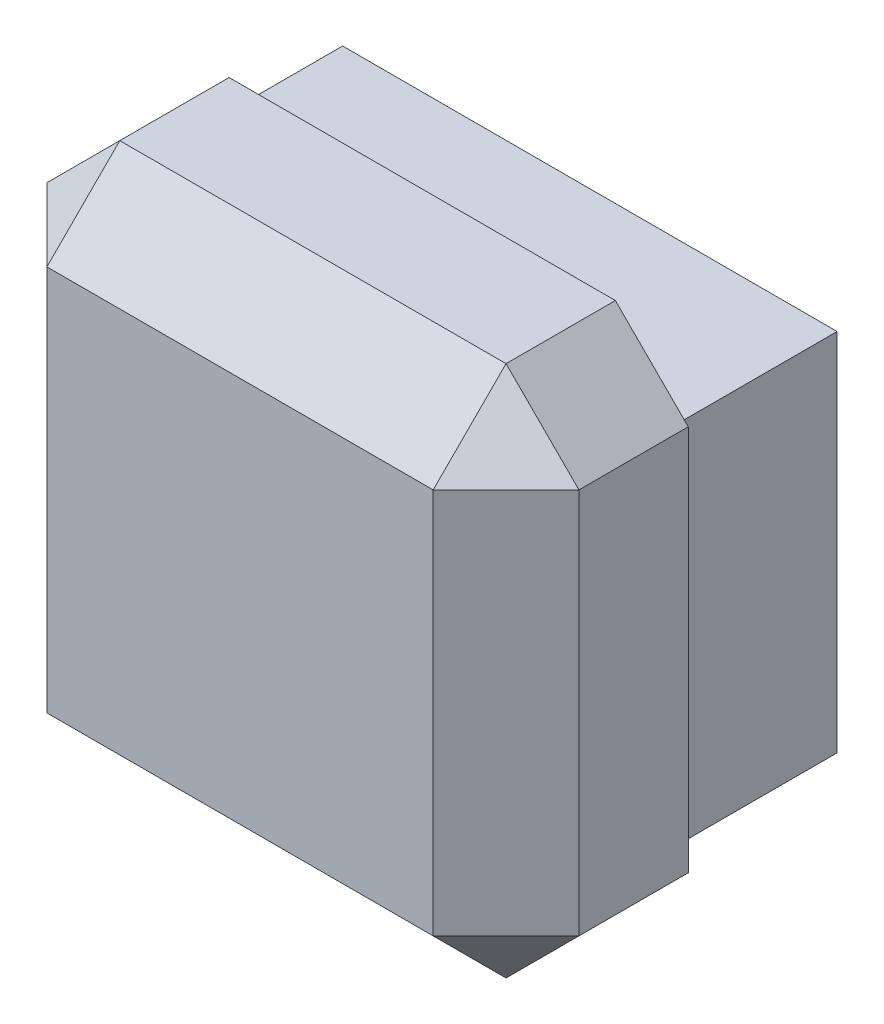
ISO-10303-21;
HEADER;
FILE_DESCRIPTION(('STEP AP214'),'2;1');
FILE_NAME('part.step','',(''),(''),'','','');
FILE_SCHEMA(('AUTOMOTIVE_DESIGN { 1 0 10303 214 1 1 1 1 }'));
ENDSEC;
DATA;
#1=APPLICATION_CONTEXT('core data for automotive mechanical design processes');
#2=APPLICATION_PROTOCOL_DEFINITION('international standard','automotive_design',2000,#1);
#3=PRODUCT_CONTEXT('',#1,'mechanical');
#4=PRODUCT('Part','Part','',(#3));
#5=PRODUCT_RELATED_PRODUCT_CATEGORY('part','',(#4));
#6=PRODUCT_DEFINITION_FORMATION('','',#4);
#7=PRODUCT_DEFINITION_CONTEXT('part definition',#1,'design');
#8=PRODUCT_DEFINITION('design','',#6,#7);
#9=PRODUCT_DEFINITION_SHAPE('','',#8);
#10=(LENGTH_UNIT() NAMED_UNIT(*) SI_UNIT(.MILLI.,.METRE.));
#11=(NAMED_UNIT(*) PLANE_ANGLE_UNIT() SI_UNIT($,.RADIAN.));
#12=(NAMED_UNIT(*) SI_UNIT($,.STERADIAN.) SOLID_ANGLE_UNIT());
#13=UNCERTAINTY_MEASURE_WITH_UNIT(LENGTH_MEASURE(1.E-05),#10,'distance_accuracy_value','');
#14=(GEOMETRIC_REPRESENTATION_CONTEXT(3) GLOBAL_UNCERTAINTY_ASSIGNED_CONTEXT((#13)) GLOBAL_UNIT_ASSIGNED_CONTEXT((#10,
#11,#12)) REPRESENTATION_CONTEXT('',''));
#15=CARTESIAN_POINT('',(0.,0.,0.));
#16=DIRECTION('',(0.,0.,1.));
#17=DIRECTION('',(1.,0.,0.));
#18=AXIS2_PLACEMENT_3D('',#15,#16,#17);
#19=CARTESIAN_POINT('',(3.3923,-2.5033,-2.3));
#20=DIRECTION('',(1.,0.,0.));
#21=DIRECTION('',(0.,0.,-1.));
#22=AXIS2_PLACEMENT_3D('',#19,#20,#21);
#23=PLANE('',#22);
#24=DIRECTION('',(0.,1.,0.));
#25=VECTOR('',#24,1.);
#26=CARTESIAN_POINT('',(3.3923,-2.5033,0.));
#27=LINE('',#26,#25);
#28=CARTESIAN_POINT('',(3.3923,-2.5033,0.));
#29=VERTEX_POINT('',#28);
#30=CARTESIAN_POINT('',(3.3923,2.5033,0.));
#31=VERTEX_POINT('',#30);
#32=EDGE_CURVE('E209',#29,#31,#27,.T.);
#33=ORIENTED_EDGE('',*,*,#32,.F.);
#34=DIRECTION('',(0.,0.,1.));
#35=VECTOR('',#34,1.);
#36=CARTESIAN_POINT('',(3.3923,-2.5033,-2.3));
#37=LINE('',#36,#35);
#38=CARTESIAN_POINT('',(3.3923,-2.5033,-2.3));
#39=VERTEX_POINT('',#38);
#40=EDGE_CURVE('E236',#39,#29,#37,.T.);
#41=ORIENTED_EDGE('',*,*,#40,.F.);
#42=DIRECTION('',(0.,1.,0.));
#43=VECTOR('',#42,1.);
#44=CARTESIAN_POINT('',(3.3923,-2.5033,-2.3));
#45=LINE('',#44,#43);
#46=CARTESIAN_POINT('',(3.3923,2.5033,-2.3));
#47=VERTEX_POINT('',#46);
#48=EDGE_CURVE('E212',#39,#47,#45,.T.);
#49=ORIENTED_EDGE('',*,*,#48,.T.);
#50=DIRECTION('',(0.,0.,1.));
#51=VECTOR('',#50,1.);
#52=CARTESIAN_POINT('',(3.3923,2.5033,-2.3));
#53=LINE('',#52,#51);
#54=EDGE_CURVE('E225',#47,#31,#53,.T.);
#55=ORIENTED_EDGE('',*,*,#54,.T.);
#56=EDGE_LOOP('',(#33,#41,#49,#55));
#57=FACE_BOUND('',#56,.T.);
#58=ADVANCED_FACE('F33',(#57),#23,.T.);
#59=CARTESIAN_POINT('',(-3.3923,-2.5033,-2.3));
#60=DIRECTION('',(0.,-1.,0.));
#61=DIRECTION('',(0.,0.,-1.));
#62=AXIS2_PLACEMENT_3D('',#59,#60,#61);
#63=PLANE('',#62);
#64=DIRECTION('',(1.,0.,0.));
#65=VECTOR('',#64,1.);
#66=CARTESIAN_POINT('',(-3.3923,-2.5033,0.));
#67=LINE('',#66,#65);
#68=CARTESIAN_POINT('',(-3.3923,-2.5033,0.));
#69=VERTEX_POINT('',#68);
#70=EDGE_CURVE('E216',#69,#29,#67,.T.);
#71=ORIENTED_EDGE('',*,*,#70,.F.);
#72=DIRECTION('',(0.,0.,1.));
#73=VECTOR('',#72,1.);
#74=CARTESIAN_POINT('',(-3.3923,-2.5033,-2.3));
#75=LINE('',#74,#73);
#76=CARTESIAN_POINT('',(-3.3923,-2.5033,-2.3));
#77=VERTEX_POINT('',#76);
#78=EDGE_CURVE('E240',#77,#69,#75,.T.);
#79=ORIENTED_EDGE('',*,*,#78,.F.);
#80=DIRECTION('',(1.,0.,0.));
#81=VECTOR('',#80,1.);
#82=CARTESIAN_POINT('',(-3.3923,-2.5033,-2.3));
#83=LINE('',#82,#81);
#84=EDGE_CURVE('E222',#77,#39,#83,.T.);
#85=ORIENTED_EDGE('',*,*,#84,.T.);
#86=ORIENTED_EDGE('',*,*,#40,.T.);
#87=EDGE_LOOP('',(#71,#79,#85,#86));
#88=FACE_BOUND('',#87,.T.);
#89=ADVANCED_FACE('F383',(#88),#63,.T.);
#90=CARTESIAN_POINT('',(-3.3923,-2.5033,-2.3));
#91=DIRECTION('',(-1.,0.,0.));
#92=DIRECTION('',(0.,0.,1.));
#93=AXIS2_PLACEMENT_3D('',#90,#91,#92);
#94=PLANE('',#93);
#95=DIRECTION('',(0.,-1.,0.));
#96=VECTOR('',#95,1.);
#97=CARTESIAN_POINT('',(-3.3923,-2.5033,0.));
#98=LINE('',#97,#96);
#99=CARTESIAN_POINT('',(-3.3923,2.5033,0.));
#100=VERTEX_POINT('',#99);
#101=EDGE_CURVE('E231',#100,#69,#98,.T.);
#102=ORIENTED_EDGE('',*,*,#101,.F.);
#103=DIRECTION('',(0.,0.,1.));
#104=VECTOR('',#103,1.);
#105=CARTESIAN_POINT('',(-3.3923,2.5033,-2.3));
#106=LINE('',#105,#104);
#107=CARTESIAN_POINT('',(-3.3923,2.5033,-2.3));
#108=VERTEX_POINT('',#107);
#109=EDGE_CURVE('E242',#108,#100,#106,.T.);
#110=ORIENTED_EDGE('',*,*,#109,.F.);
#111=DIRECTION('',(0.,-1.,0.));
#112=VECTOR('',#111,1.);
#113=CARTESIAN_POINT('',(-3.3923,-2.5033,-2.3));
#114=LINE('',#113,#112);
#115=EDGE_CURVE('E219',#108,#77,#114,.T.);
#116=ORIENTED_EDGE('',*,*,#115,.T.);
#117=ORIENTED_EDGE('',*,*,#78,.T.);
#118=EDGE_LOOP('',(#102,#110,#116,#117));
#119=FACE_BOUND('',#118,.T.);
#120=ADVANCED_FACE('F389',(#119),#94,.T.);
#121=CARTESIAN_POINT('',(-3.3923,2.5033,-2.3));
#122=DIRECTION('',(0.,1.,0.));
#123=DIRECTION('',(0.,0.,1.));
#124=AXIS2_PLACEMENT_3D('',#121,#122,#123);
#125=PLANE('',#124);
#126=DIRECTION('',(-1.,0.,0.));
#127=VECTOR('',#126,1.);
#128=CARTESIAN_POINT('',(-3.3923,2.5033,0.));
#129=LINE('',#128,#127);
#130=EDGE_CURVE('E228',#31,#100,#129,.T.);
#131=ORIENTED_EDGE('',*,*,#130,.F.);
#132=ORIENTED_EDGE('',*,*,#54,.F.);
#133=DIRECTION('',(-1.,0.,0.));
#134=VECTOR('',#133,1.);
#135=CARTESIAN_POINT('',(-3.3923,2.5033,-2.3));
#136=LINE('',#135,#134);
#137=EDGE_CURVE('E215',#47,#108,#136,.T.);
#138=ORIENTED_EDGE('',*,*,#137,.T.);
#139=ORIENTED_EDGE('',*,*,#109,.T.);
#140=EDGE_LOOP('',(#131,#132,#138,#139));
#141=FACE_BOUND('',#140,.T.);
#142=ADVANCED_FACE('F394',(#141),#125,.T.);
#143=CARTESIAN_POINT('',(0.,0.,-2.3));
#144=DIRECTION('',(0.,0.,-1.));
#145=DIRECTION('',(-1.,0.,0.));
#146=AXIS2_PLACEMENT_3D('',#143,#144,#145);
#147=PLANE('',#146);
#148=DIRECTION('',(0.,1.,0.));
#149=VECTOR('',#148,1.);
#150=CARTESIAN_POINT('',(1.9423,-1.0533,-2.3));
#151=LINE('',#150,#149);
#152=CARTESIAN_POINT('',(1.9423,-1.0533,-2.3));
#153=VERTEX_POINT('',#152);
#154=CARTESIAN_POINT('',(1.9423,1.0533,-2.3));
#155=VERTEX_POINT('',#154);
#156=EDGE_CURVE('E198',#153,#155,#151,.T.);
#157=ORIENTED_EDGE('',*,*,#156,.T.);
#158=DIRECTION('',(-1.,0.,0.));
#159=VECTOR('',#158,1.);
#160=CARTESIAN_POINT('',(-1.9423,1.0533,-2.3));
#161=LINE('',#160,#159);
#162=CARTESIAN_POINT('',(-1.9423,1.0533,-2.3));
#163=VERTEX_POINT('',#162);
#164=EDGE_CURVE('E201',#155,#163,#161,.T.);
#165=ORIENTED_EDGE('',*,*,#164,.T.);
#166=DIRECTION('',(0.,-1.,0.));
#167=VECTOR('',#166,1.);
#168=CARTESIAN_POINT('',(-1.9423,-1.0533,-2.3));
#169=LINE('',#168,#167);
#170=CARTESIAN_POINT('',(-1.9423,-1.0533,-2.3));
#171=VERTEX_POINT('',#170);
#172=EDGE_CURVE('E164',#163,#171,#169,.T.);
#173=ORIENTED_EDGE('',*,*,#172,.T.);
#174=DIRECTION('',(1.,0.,0.));
#175=VECTOR('',#174,1.);
#176=CARTESIAN_POINT('',(-1.9423,-1.0533,-2.3));
#177=LINE('',#176,#175);
#178=EDGE_CURVE('E204',#171,#153,#177,.T.);
#179=ORIENTED_EDGE('',*,*,#178,.T.);
#180=EDGE_LOOP('',(#157,#165,#173,#179));
#181=FACE_BOUND('',#180,.T.);
#182=ORIENTED_EDGE('',*,*,#48,.F.);
#183=ORIENTED_EDGE('',*,*,#84,.F.);
#184=ORIENTED_EDGE('',*,*,#115,.F.);
#185=ORIENTED_EDGE('',*,*,#137,.F.);
#186=EDGE_LOOP('',(#182,#183,#184,#185));
#187=FACE_BOUND('',#186,.T.);
#188=ADVANCED_FACE('F429',(#181,#187),#147,.T.);
#189=CARTESIAN_POINT('',(1.9423,-1.0533,-2.3));
#190=DIRECTION('',(1.,0.,0.));
#191=DIRECTION('',(0.,0.,-1.));
#192=AXIS2_PLACEMENT_3D('',#189,#190,#191);
#193=PLANE('',#192);
#194=DIRECTION('',(0.,0.,1.));
#195=VECTOR('',#194,1.);
#196=CARTESIAN_POINT('',(1.9423,-1.0533,-2.3));
#197=LINE('',#196,#195);
#198=CARTESIAN_POINT('',(1.9423,-1.0533,1.1));
#199=VERTEX_POINT('',#198);
#200=EDGE_CURVE('E207',#153,#199,#197,.T.);
#201=ORIENTED_EDGE('',*,*,#200,.T.);
#202=DIRECTION('',(0.,-1.,0.));
#203=VECTOR('',#202,1.);
#204=CARTESIAN_POINT('',(1.9423,1.0533,1.1));
#205=LINE('',#204,#203);
#206=CARTESIAN_POINT('',(1.9423,1.0533,1.1));
#207=VERTEX_POINT('',#206);
#208=EDGE_CURVE('E177',#207,#199,#205,.T.);
#209=ORIENTED_EDGE('',*,*,#208,.F.);
#210=DIRECTION('',(0.,0.,1.));
#211=VECTOR('',#210,1.);
#212=CARTESIAN_POINT('',(1.9423,1.0533,-2.3));
#213=LINE('',#212,#211);
#214=EDGE_CURVE('E169',#155,#207,#213,.T.);
#215=ORIENTED_EDGE('',*,*,#214,.F.);
#216=ORIENTED_EDGE('',*,*,#156,.F.);
#217=EDGE_LOOP('',(#201,#209,#215,#216));
#218=FACE_BOUND('',#217,.T.);
#219=ADVANCED_FACE('F421',(#218),#193,.F.);
#220=CARTESIAN_POINT('',(-1.9423,-1.0533,-2.3));
#221=DIRECTION('',(0.,-1.,0.));
#222=DIRECTION('',(0.,0.,-1.));
#223=AXIS2_PLACEMENT_3D('',#220,#221,#222);
#224=PLANE('',#223);
#225=DIRECTION('',(0.,0.,1.));
#226=VECTOR('',#225,1.);
#227=CARTESIAN_POINT('',(-1.9423,-1.0533,-2.3));
#228=LINE('',#227,#226);
#229=CARTESIAN_POINT('',(-1.9423,-1.0533,1.1));
#230=VERTEX_POINT('',#229);
#231=EDGE_CURVE('E168',#171,#230,#228,.T.);
#232=ORIENTED_EDGE('',*,*,#231,.T.);
#233=DIRECTION('',(-1.,0.,0.));
#234=VECTOR('',#233,1.);
#235=CARTESIAN_POINT('',(1.9423,-1.0533,1.1));
#236=LINE('',#235,#234);
#237=EDGE_CURVE('E181',#199,#230,#236,.T.);
#238=ORIENTED_EDGE('',*,*,#237,.F.);
#239=ORIENTED_EDGE('',*,*,#200,.F.);
#240=ORIENTED_EDGE('',*,*,#178,.F.);
#241=EDGE_LOOP('',(#232,#238,#239,#240));
#242=FACE_BOUND('',#241,.T.);
#243=ADVANCED_FACE('F418',(#242),#224,.F.);
#244=CARTESIAN_POINT('',(-1.9423,-1.0533,-2.3));
#245=DIRECTION('',(-1.,0.,0.));
#246=DIRECTION('',(0.,0.,1.));
#247=AXIS2_PLACEMENT_3D('',#244,#245,#246);
#248=PLANE('',#247);
#249=DIRECTION('',(0.,0.,1.));
#250=VECTOR('',#249,1.);
#251=CARTESIAN_POINT('',(-1.9423,1.0533,-2.3));
#252=LINE('',#251,#250);
#253=CARTESIAN_POINT('',(-1.9423,1.0533,1.1));
#254=VERTEX_POINT('',#253);
#255=EDGE_CURVE('E157',#163,#254,#252,.T.);
#256=ORIENTED_EDGE('',*,*,#255,.T.);
#257=DIRECTION('',(0.,1.,0.));
#258=VECTOR('',#257,1.);
#259=CARTESIAN_POINT('',(-1.9423,-1.0533,1.1));
#260=LINE('',#259,#258);
#261=EDGE_CURVE('E161',#230,#254,#260,.T.);
#262=ORIENTED_EDGE('',*,*,#261,.F.);
#263=ORIENTED_EDGE('',*,*,#231,.F.);
#264=ORIENTED_EDGE('',*,*,#172,.F.);
#265=EDGE_LOOP('',(#256,#262,#263,#264));
#266=FACE_BOUND('',#265,.T.);
#267=ADVANCED_FACE('F159',(#266),#248,.F.);
#268=CARTESIAN_POINT('',(-1.9423,1.0533,-2.3));
#269=DIRECTION('',(0.,1.,0.));
#270=DIRECTION('',(0.,0.,1.));
#271=AXIS2_PLACEMENT_3D('',#268,#269,#270);
#272=PLANE('',#271);
#273=ORIENTED_EDGE('',*,*,#214,.T.);
#274=DIRECTION('',(1.,0.,0.));
#275=VECTOR('',#274,1.);
#276=CARTESIAN_POINT('',(-1.9423,1.0533,1.1));
#277=LINE('',#276,#275);
#278=EDGE_CURVE('E172',#254,#207,#277,.T.);
#279=ORIENTED_EDGE('',*,*,#278,.F.);
#280=ORIENTED_EDGE('',*,*,#255,.F.);
#281=ORIENTED_EDGE('',*,*,#164,.F.);
#282=EDGE_LOOP('',(#273,#279,#280,#281));
#283=FACE_BOUND('',#282,.T.);
#284=ADVANCED_FACE('F173',(#283),#272,.F.);
#285=CARTESIAN_POINT('',(0.,0.,0.));
#286=DIRECTION('',(0.,0.,-1.));
#287=DIRECTION('',(-1.,0.,0.));
#288=AXIS2_PLACEMENT_3D('',#285,#286,#287);
#289=PLANE('',#288);
#290=ORIENTED_EDGE('',*,*,#70,.T.);
#291=ORIENTED_EDGE('',*,*,#32,.T.);
#292=ORIENTED_EDGE('',*,*,#130,.T.);
#293=ORIENTED_EDGE('',*,*,#101,.T.);
#294=EDGE_LOOP('',(#290,#291,#292,#293));
#295=FACE_BOUND('',#294,.T.);
#296=DIRECTION('',(0.,1.,0.));
#297=VECTOR('',#296,1.);
#298=CARTESIAN_POINT('',(3.65,-3.65,0.));
#299=LINE('',#298,#297);
#300=CARTESIAN_POINT('',(3.65,-2.65,0.));
#301=VERTEX_POINT('',#300);
#302=CARTESIAN_POINT('',(3.65,2.65,0.));
#303=VERTEX_POINT('',#302);
#304=EDGE_CURVE('E187',#301,#303,#299,.T.);
#305=ORIENTED_EDGE('',*,*,#304,.F.);
#306=DIRECTION('',(0.707106781186546,0.707106781186549,0.));
#307=VECTOR('',#306,1.);
#308=CARTESIAN_POINT('',(3.15,-3.14999999999999,0.));
#309=LINE('',#308,#307);
#310=CARTESIAN_POINT('',(2.65,-3.65,0.));
#311=VERTEX_POINT('',#310);
#312=EDGE_CURVE('E272',#301,#311,#309,.F.);
#313=ORIENTED_EDGE('',*,*,#312,.T.);
#314=DIRECTION('',(1.,0.,0.));
#315=VECTOR('',#314,1.);
#316=CARTESIAN_POINT('',(-3.65,-3.65,0.));
#317=LINE('',#316,#315);
#318=CARTESIAN_POINT('',(-2.65,-3.65,0.));
#319=VERTEX_POINT('',#318);
#320=EDGE_CURVE('E195',#319,#311,#317,.T.);
#321=ORIENTED_EDGE('',*,*,#320,.F.);
#322=DIRECTION('',(0.707106781186546,-0.707106781186549,0.));
#323=VECTOR('',#322,1.);
#324=CARTESIAN_POINT('',(-3.15000000000001,-3.14999999999999,0.));
#325=LINE('',#324,#323);
#326=CARTESIAN_POINT('',(-3.65,-2.65,0.));
#327=VERTEX_POINT('',#326);
#328=EDGE_CURVE('E266',#319,#327,#325,.F.);
#329=ORIENTED_EDGE('',*,*,#328,.T.);
#330=DIRECTION('',(0.,-1.,0.));
#331=VECTOR('',#330,1.);
#332=CARTESIAN_POINT('',(-3.65,-3.65,0.));
#333=LINE('',#332,#331);
#334=CARTESIAN_POINT('',(-3.65,2.65,0.));
#335=VERTEX_POINT('',#334);
#336=EDGE_CURVE('E193',#335,#327,#333,.T.);
#337=ORIENTED_EDGE('',*,*,#336,.F.);
#338=DIRECTION('',(-0.707106781186546,-0.707106781186549,0.));
#339=VECTOR('',#338,1.);
#340=CARTESIAN_POINT('',(-3.15,3.14999999999999,0.));
#341=LINE('',#340,#339);
#342=CARTESIAN_POINT('',(-2.65,3.65,0.));
#343=VERTEX_POINT('',#342);
#344=EDGE_CURVE('E268',#335,#343,#341,.F.);
#345=ORIENTED_EDGE('',*,*,#344,.T.);
#346=DIRECTION('',(-1.,0.,0.));
#347=VECTOR('',#346,1.);
#348=CARTESIAN_POINT('',(-3.65,3.65,0.));
#349=LINE('',#348,#347);
#350=CARTESIAN_POINT('',(2.65,3.65,0.));
#351=VERTEX_POINT('',#350);
#352=EDGE_CURVE('E190',#351,#343,#349,.T.);
#353=ORIENTED_EDGE('',*,*,#352,.F.);
#354=DIRECTION('',(-0.707106781186546,0.707106781186549,0.));
#355=VECTOR('',#354,1.);
#356=CARTESIAN_POINT('',(3.15,3.14999999999999,0.));
#357=LINE('',#356,#355);
#358=EDGE_CURVE('E270',#351,#303,#357,.F.);
#359=ORIENTED_EDGE('',*,*,#358,.T.);
#360=EDGE_LOOP('',(#305,#313,#321,#329,#337,#345,#353,#359));
#361=FACE_BOUND('',#360,.T.);
#362=ADVANCED_FACE('F345',(#295,#361),#289,.T.);
#363=CARTESIAN_POINT('',(0.,0.,2.5));
#364=DIRECTION('',(0.,0.,-1.));
#365=DIRECTION('',(-1.,0.,0.));
#366=AXIS2_PLACEMENT_3D('',#363,#364,#365);
#367=PLANE('',#366);
#368=DIRECTION('',(0.,-1.,0.));
#369=VECTOR('',#368,1.);
#370=CARTESIAN_POINT('',(-2.65,0.,2.5));
#371=LINE('',#370,#369);
#372=CARTESIAN_POINT('',(-2.65,2.65,2.5));
#373=VERTEX_POINT('',#372);
#374=CARTESIAN_POINT('',(-2.65,-2.65,2.5));
#375=VERTEX_POINT('',#374);
#376=EDGE_CURVE('E239',#373,#375,#371,.T.);
#377=ORIENTED_EDGE('',*,*,#376,.T.);
#378=DIRECTION('',(1.,0.,0.));
#379=VECTOR('',#378,1.);
#380=CARTESIAN_POINT('',(0.,-2.65,2.5));
#381=LINE('',#380,#379);
#382=CARTESIAN_POINT('',(2.65,-2.65,2.5));
#383=VERTEX_POINT('',#382);
#384=EDGE_CURVE('E250',#375,#383,#381,.T.);
#385=ORIENTED_EDGE('',*,*,#384,.T.);
#386=DIRECTION('',(0.,1.,0.));
#387=VECTOR('',#386,1.);
#388=CARTESIAN_POINT('',(2.65,0.,2.5));
#389=LINE('',#388,#387);
#390=CARTESIAN_POINT('',(2.65,2.65,2.5));
#391=VERTEX_POINT('',#390);
#392=EDGE_CURVE('E248',#383,#391,#389,.T.);
#393=ORIENTED_EDGE('',*,*,#392,.T.);
#394=DIRECTION('',(-1.,0.,0.));
#395=VECTOR('',#394,1.);
#396=CARTESIAN_POINT('',(0.,2.65,2.5));
#397=LINE('',#396,#395);
#398=EDGE_CURVE('E246',#391,#373,#397,.T.);
#399=ORIENTED_EDGE('',*,*,#398,.T.);
#400=EDGE_LOOP('',(#377,#385,#393,#399));
#401=FACE_BOUND('',#400,.T.);
#402=ADVANCED_FACE('F325',(#401),#367,.F.);
#403=CARTESIAN_POINT('',(-3.65,-3.65,2.5));
#404=DIRECTION('',(0.,1.,0.));
#405=DIRECTION('',(0.,0.,1.));
#406=AXIS2_PLACEMENT_3D('',#403,#404,#405);
#407=PLANE('',#406);
#408=ORIENTED_EDGE('',*,*,#320,.T.);
#409=DIRECTION('',(0.,0.,1.));
#410=VECTOR('',#409,1.);
#411=CARTESIAN_POINT('',(2.65,-3.65,2.5));
#412=LINE('',#411,#410);
#413=CARTESIAN_POINT('',(2.65,-3.65,1.5));
#414=VERTEX_POINT('',#413);
#415=EDGE_CURVE('E258',#311,#414,#412,.T.);
#416=ORIENTED_EDGE('',*,*,#415,.T.);
#417=DIRECTION('',(-1.,0.,0.));
#418=VECTOR('',#417,1.);
#419=CARTESIAN_POINT('',(-3.65,-3.65,1.5));
#420=LINE('',#419,#418);
#421=CARTESIAN_POINT('',(-2.65,-3.65,1.5));
#422=VERTEX_POINT('',#421);
#423=EDGE_CURVE('E255',#414,#422,#420,.T.);
#424=ORIENTED_EDGE('',*,*,#423,.T.);
#425=DIRECTION('',(0.,0.,-1.));
#426=VECTOR('',#425,1.);
#427=CARTESIAN_POINT('',(-2.65,-3.65,2.5));
#428=LINE('',#427,#426);
#429=EDGE_CURVE('E253',#422,#319,#428,.T.);
#430=ORIENTED_EDGE('',*,*,#429,.T.);
#431=EDGE_LOOP('',(#408,#416,#424,#430));
#432=FACE_BOUND('',#431,.T.);
#433=ADVANCED_FACE('F365',(#432),#407,.F.);
#434=CARTESIAN_POINT('',(-3.65,-3.65,2.5));
#435=DIRECTION('',(1.,0.,0.));
#436=DIRECTION('',(0.,0.,-1.));
#437=AXIS2_PLACEMENT_3D('',#434,#435,#436);
#438=PLANE('',#437);
#439=DIRECTION('',(0.,1.,0.));
#440=VECTOR('',#439,1.);
#441=CARTESIAN_POINT('',(-3.65,-3.65,1.5));
#442=LINE('',#441,#440);
#443=CARTESIAN_POINT('',(-3.65,-2.65,1.5));
#444=VERTEX_POINT('',#443);
#445=CARTESIAN_POINT('',(-3.65,2.65,1.5));
#446=VERTEX_POINT('',#445);
#447=EDGE_CURVE('E42',#444,#446,#442,.T.);
#448=ORIENTED_EDGE('',*,*,#447,.T.);
#449=DIRECTION('',(0.,0.,-1.));
#450=VECTOR('',#449,1.);
#451=CARTESIAN_POINT('',(-3.65,2.65,2.5));
#452=LINE('',#451,#450);
#453=EDGE_CURVE('E11',#446,#335,#452,.T.);
#454=ORIENTED_EDGE('',*,*,#453,.T.);
#455=ORIENTED_EDGE('',*,*,#336,.T.);
#456=DIRECTION('',(0.,0.,1.));
#457=VECTOR('',#456,1.);
#458=CARTESIAN_POINT('',(-3.65,-2.65,2.5));
#459=LINE('',#458,#457);
#460=EDGE_CURVE('E53',#327,#444,#459,.T.);
#461=ORIENTED_EDGE('',*,*,#460,.T.);
#462=EDGE_LOOP('',(#448,#454,#455,#461));
#463=FACE_BOUND('',#462,.T.);
#464=ADVANCED_FACE('F411',(#463),#438,.F.);
#465=CARTESIAN_POINT('',(-3.65,3.65,2.5));
#466=DIRECTION('',(0.,-1.,0.));
#467=DIRECTION('',(0.,0.,-1.));
#468=AXIS2_PLACEMENT_3D('',#465,#466,#467);
#469=PLANE('',#468);
#470=DIRECTION('',(1.,0.,0.));
#471=VECTOR('',#470,1.);
#472=CARTESIAN_POINT('',(-3.65,3.65,1.5));
#473=LINE('',#472,#471);
#474=CARTESIAN_POINT('',(-2.65,3.65,1.5));
#475=VERTEX_POINT('',#474);
#476=CARTESIAN_POINT('',(2.65,3.65,1.5));
#477=VERTEX_POINT('',#476);
#478=EDGE_CURVE('E276',#475,#477,#473,.T.);
#479=ORIENTED_EDGE('',*,*,#478,.T.);
#480=DIRECTION('',(0.,0.,-1.));
#481=VECTOR('',#480,1.);
#482=CARTESIAN_POINT('',(2.65,3.65,2.5));
#483=LINE('',#482,#481);
#484=EDGE_CURVE('E278',#477,#351,#483,.T.);
#485=ORIENTED_EDGE('',*,*,#484,.T.);
#486=ORIENTED_EDGE('',*,*,#352,.T.);
#487=DIRECTION('',(0.,0.,1.));
#488=VECTOR('',#487,1.);
#489=CARTESIAN_POINT('',(-2.65,3.65,2.5));
#490=LINE('',#489,#488);
#491=EDGE_CURVE('E274',#343,#475,#490,.T.);
#492=ORIENTED_EDGE('',*,*,#491,.T.);
#493=EDGE_LOOP('',(#479,#485,#486,#492));
#494=FACE_BOUND('',#493,.T.);
#495=ADVANCED_FACE('F335',(#494),#469,.F.);
#496=CARTESIAN_POINT('',(3.65,-3.65,2.5));
#497=DIRECTION('',(-1.,0.,0.));
#498=DIRECTION('',(0.,0.,1.));
#499=AXIS2_PLACEMENT_3D('',#496,#497,#498);
#500=PLANE('',#499);
#501=DIRECTION('',(0.,-1.,0.));
#502=VECTOR('',#501,1.);
#503=CARTESIAN_POINT('',(3.65,-3.65,1.5));
#504=LINE('',#503,#502);
#505=CARTESIAN_POINT('',(3.65,2.65,1.5));
#506=VERTEX_POINT('',#505);
#507=CARTESIAN_POINT('',(3.65,-2.65,1.5));
#508=VERTEX_POINT('',#507);
#509=EDGE_CURVE('E262',#506,#508,#504,.T.);
#510=ORIENTED_EDGE('',*,*,#509,.T.);
#511=DIRECTION('',(0.,0.,-1.));
#512=VECTOR('',#511,1.);
#513=CARTESIAN_POINT('',(3.65,-2.65,2.5));
#514=LINE('',#513,#512);
#515=EDGE_CURVE('E264',#508,#301,#514,.T.);
#516=ORIENTED_EDGE('',*,*,#515,.T.);
#517=ORIENTED_EDGE('',*,*,#304,.T.);
#518=DIRECTION('',(0.,0.,1.));
#519=VECTOR('',#518,1.);
#520=CARTESIAN_POINT('',(3.65,2.65,2.5));
#521=LINE('',#520,#519);
#522=EDGE_CURVE('E260',#303,#506,#521,.T.);
#523=ORIENTED_EDGE('',*,*,#522,.T.);
#524=EDGE_LOOP('',(#510,#516,#517,#523));
#525=FACE_BOUND('',#524,.T.);
#526=ADVANCED_FACE('F348',(#525),#500,.F.);
#527=CARTESIAN_POINT('',(-3.65,2.65,2.5));
#528=DIRECTION('',(0.707106781186549,-0.707106781186546,0.));
#529=DIRECTION('',(0.,0.,-1.));
#530=AXIS2_PLACEMENT_3D('',#527,#528,#529);
#531=PLANE('',#530);
#532=ORIENTED_EDGE('',*,*,#344,.F.);
#533=ORIENTED_EDGE('',*,*,#453,.F.);
#534=DIRECTION('',(0.707106781186546,0.707106781186549,0.));
#535=VECTOR('',#534,1.);
#536=CARTESIAN_POINT('',(-3.15,3.15,1.5));
#537=LINE('',#536,#535);
#538=EDGE_CURVE('E37',#475,#446,#537,.F.);
#539=ORIENTED_EDGE('',*,*,#538,.F.);
#540=ORIENTED_EDGE('',*,*,#491,.F.);
#541=EDGE_LOOP('',(#532,#533,#539,#540));
#542=FACE_BOUND('',#541,.T.);
#543=ADVANCED_FACE('F35',(#542),#531,.F.);
#544=CARTESIAN_POINT('',(0.,2.65,2.5));
#545=DIRECTION('',(0.,-0.707106781186549,-0.707106781186546));
#546=DIRECTION('',(-1.,0.,0.));
#547=AXIS2_PLACEMENT_3D('',#544,#545,#546);
#548=PLANE('',#547);
#549=DIRECTION('',(0.,0.707106781186546,-0.707106781186549));
#550=VECTOR('',#549,1.);
#551=CARTESIAN_POINT('',(2.65,2.65,2.5));
#552=LINE('',#551,#550);
#553=EDGE_CURVE('E306',#477,#391,#552,.F.);
#554=ORIENTED_EDGE('',*,*,#553,.F.);
#555=ORIENTED_EDGE('',*,*,#478,.F.);
#556=DIRECTION('',(0.,-0.707106781186546,0.707106781186549));
#557=VECTOR('',#556,1.);
#558=CARTESIAN_POINT('',(-2.65,2.65,2.5));
#559=LINE('',#558,#557);
#560=EDGE_CURVE('E308',#373,#475,#559,.F.);
#561=ORIENTED_EDGE('',*,*,#560,.F.);
#562=ORIENTED_EDGE('',*,*,#398,.F.);
#563=EDGE_LOOP('',(#554,#555,#561,#562));
#564=FACE_BOUND('',#563,.T.);
#565=ADVANCED_FACE('F332',(#564),#548,.F.);
#566=CARTESIAN_POINT('',(2.65,3.65,2.5));
#567=DIRECTION('',(-0.707106781186549,-0.707106781186546,0.));
#568=DIRECTION('',(0.,0.,-1.));
#569=AXIS2_PLACEMENT_3D('',#566,#567,#568);
#570=PLANE('',#569);
#571=ORIENTED_EDGE('',*,*,#358,.F.);
#572=ORIENTED_EDGE('',*,*,#484,.F.);
#573=DIRECTION('',(0.707106781186546,-0.707106781186549,0.));
#574=VECTOR('',#573,1.);
#575=CARTESIAN_POINT('',(3.15,3.15,1.5));
#576=LINE('',#575,#574);
#577=EDGE_CURVE('E303',#506,#477,#576,.F.);
#578=ORIENTED_EDGE('',*,*,#577,.F.);
#579=ORIENTED_EDGE('',*,*,#522,.F.);
#580=EDGE_LOOP('',(#571,#572,#578,#579));
#581=FACE_BOUND('',#580,.T.);
#582=ADVANCED_FACE('F340',(#581),#570,.F.);
#583=CARTESIAN_POINT('',(-2.65,2.65,2.5));
#584=DIRECTION('',(-0.577350269189628,0.577350269189626,0.577350269189624));
#585=DIRECTION('',(-0.707106781186546,-0.707106781186549,0.));
#586=AXIS2_PLACEMENT_3D('',#583,#584,#585);
#587=PLANE('',#586);
#588=ORIENTED_EDGE('',*,*,#560,.T.);
#589=ORIENTED_EDGE('',*,*,#538,.T.);
#590=DIRECTION('',(-0.707106781186546,0.,-0.707106781186549));
#591=VECTOR('',#590,1.);
#592=CARTESIAN_POINT('',(-2.65,2.65,2.5));
#593=LINE('',#592,#591);
#594=EDGE_CURVE('E300',#373,#446,#593,.T.);
#595=ORIENTED_EDGE('',*,*,#594,.F.);
#596=EDGE_LOOP('',(#588,#589,#595));
#597=FACE_BOUND('',#596,.T.);
#598=ADVANCED_FACE('F315',(#597),#587,.T.);
#599=CARTESIAN_POINT('',(2.65,2.65,2.5));
#600=DIRECTION('',(0.577350269189628,0.577350269189626,0.577350269189624));
#601=DIRECTION('',(-0.707106781186546,0.707106781186549,0.));
#602=AXIS2_PLACEMENT_3D('',#599,#600,#601);
#603=PLANE('',#602);
#604=ORIENTED_EDGE('',*,*,#577,.T.);
#605=ORIENTED_EDGE('',*,*,#553,.T.);
#606=DIRECTION('',(-0.707106781186546,0.,0.707106781186549));
#607=VECTOR('',#606,1.);
#608=CARTESIAN_POINT('',(2.65,2.65,2.5));
#609=LINE('',#608,#607);
#610=EDGE_CURVE('E297',#506,#391,#609,.T.);
#611=ORIENTED_EDGE('',*,*,#610,.F.);
#612=EDGE_LOOP('',(#604,#605,#611));
#613=FACE_BOUND('',#612,.T.);
#614=ADVANCED_FACE('F515',(#613),#603,.T.);
#615=CARTESIAN_POINT('',(-2.65,-3.65,2.5));
#616=DIRECTION('',(0.707106781186549,0.707106781186546,0.));
#617=DIRECTION('',(0.,0.,-1.));
#618=AXIS2_PLACEMENT_3D('',#615,#616,#617);
#619=PLANE('',#618);
#620=ORIENTED_EDGE('',*,*,#328,.F.);
#621=ORIENTED_EDGE('',*,*,#429,.F.);
#622=DIRECTION('',(-0.707106781186546,0.707106781186549,0.));
#623=VECTOR('',#622,1.);
#624=CARTESIAN_POINT('',(-2.65,-3.65,1.5));
#625=LINE('',#624,#623);
#626=EDGE_CURVE('E294',#444,#422,#625,.F.);
#627=ORIENTED_EDGE('',*,*,#626,.F.);
#628=ORIENTED_EDGE('',*,*,#460,.F.);
#629=EDGE_LOOP('',(#620,#621,#627,#628));
#630=FACE_BOUND('',#629,.T.);
#631=ADVANCED_FACE('F371',(#630),#619,.F.);
#632=CARTESIAN_POINT('',(-2.65,0.,2.5));
#633=DIRECTION('',(0.707106781186549,0.,-0.707106781186546));
#634=DIRECTION('',(0.,-1.,0.));
#635=AXIS2_PLACEMENT_3D('',#632,#633,#634);
#636=PLANE('',#635);
#637=ORIENTED_EDGE('',*,*,#594,.T.);
#638=ORIENTED_EDGE('',*,*,#447,.F.);
#639=DIRECTION('',(0.707106781186546,0.,0.707106781186549));
#640=VECTOR('',#639,1.);
#641=CARTESIAN_POINT('',(-3.15,-2.65,2.));
#642=LINE('',#641,#640);
#643=EDGE_CURVE('E291',#375,#444,#642,.F.);
#644=ORIENTED_EDGE('',*,*,#643,.F.);
#645=ORIENTED_EDGE('',*,*,#376,.F.);
#646=EDGE_LOOP('',(#637,#638,#644,#645));
#647=FACE_BOUND('',#646,.T.);
#648=ADVANCED_FACE('F320',(#647),#636,.F.);
#649=CARTESIAN_POINT('',(2.65,0.,2.5));
#650=DIRECTION('',(-0.707106781186549,0.,-0.707106781186546));
#651=DIRECTION('',(0.,1.,0.));
#652=AXIS2_PLACEMENT_3D('',#649,#650,#651);
#653=PLANE('',#652);
#654=ORIENTED_EDGE('',*,*,#610,.T.);
#655=ORIENTED_EDGE('',*,*,#392,.F.);
#656=DIRECTION('',(0.707106781186546,0.,-0.707106781186549));
#657=VECTOR('',#656,1.);
#658=CARTESIAN_POINT('',(2.65,-2.65,2.5));
#659=LINE('',#658,#657);
#660=EDGE_CURVE('E288',#508,#383,#659,.F.);
#661=ORIENTED_EDGE('',*,*,#660,.F.);
#662=ORIENTED_EDGE('',*,*,#509,.F.);
#663=EDGE_LOOP('',(#654,#655,#661,#662));
#664=FACE_BOUND('',#663,.T.);
#665=ADVANCED_FACE('F358',(#664),#653,.F.);
#666=CARTESIAN_POINT('',(3.65,-2.65,2.5));
#667=DIRECTION('',(-0.707106781186549,0.707106781186546,0.));
#668=DIRECTION('',(0.,0.,-1.));
#669=AXIS2_PLACEMENT_3D('',#666,#667,#668);
#670=PLANE('',#669);
#671=ORIENTED_EDGE('',*,*,#312,.F.);
#672=ORIENTED_EDGE('',*,*,#515,.F.);
#673=DIRECTION('',(-0.707106781186546,-0.707106781186549,0.));
#674=VECTOR('',#673,1.);
#675=CARTESIAN_POINT('',(3.15,-3.15,1.5));
#676=LINE('',#675,#674);
#677=EDGE_CURVE('E285',#414,#508,#676,.F.);
#678=ORIENTED_EDGE('',*,*,#677,.F.);
#679=ORIENTED_EDGE('',*,*,#415,.F.);
#680=EDGE_LOOP('',(#671,#672,#678,#679));
#681=FACE_BOUND('',#680,.T.);
#682=ADVANCED_FACE('F354',(#681),#670,.F.);
#683=CARTESIAN_POINT('',(-2.65,-3.65,1.5));
#684=DIRECTION('',(-0.577350269189628,-0.577350269189624,0.577350269189626));
#685=DIRECTION('',(0.707106781186546,0.,0.707106781186549));
#686=AXIS2_PLACEMENT_3D('',#683,#684,#685);
#687=PLANE('',#686);
#688=ORIENTED_EDGE('',*,*,#643,.T.);
#689=ORIENTED_EDGE('',*,*,#626,.T.);
#690=DIRECTION('',(0.,-0.707106781186549,-0.707106781186546));
#691=VECTOR('',#690,1.);
#692=CARTESIAN_POINT('',(-2.65,-3.65,1.5));
#693=LINE('',#692,#691);
#694=EDGE_CURVE('E283',#375,#422,#693,.T.);
#695=ORIENTED_EDGE('',*,*,#694,.F.);
#696=EDGE_LOOP('',(#688,#689,#695));
#697=FACE_BOUND('',#696,.T.);
#698=ADVANCED_FACE('F373',(#697),#687,.T.);
#699=CARTESIAN_POINT('',(2.65,-2.65,2.5));
#700=DIRECTION('',(0.577350269189628,-0.577350269189624,0.577350269189626));
#701=DIRECTION('',(0.707106781186546,0.,-0.707106781186549));
#702=AXIS2_PLACEMENT_3D('',#699,#700,#701);
#703=PLANE('',#702);
#704=ORIENTED_EDGE('',*,*,#677,.T.);
#705=ORIENTED_EDGE('',*,*,#660,.T.);
#706=DIRECTION('',(0.,0.707106781186549,0.707106781186546));
#707=VECTOR('',#706,1.);
#708=CARTESIAN_POINT('',(2.65,-2.65,2.5));
#709=LINE('',#708,#707);
#710=EDGE_CURVE('E186',#414,#383,#709,.T.);
#711=ORIENTED_EDGE('',*,*,#710,.F.);
#712=EDGE_LOOP('',(#704,#705,#711));
#713=FACE_BOUND('',#712,.T.);
#714=ADVANCED_FACE('F361',(#713),#703,.T.);
#715=CARTESIAN_POINT('',(0.,-2.65,2.5));
#716=DIRECTION('',(0.,0.707106781186546,-0.707106781186549));
#717=DIRECTION('',(1.,0.,0.));
#718=AXIS2_PLACEMENT_3D('',#715,#716,#717);
#719=PLANE('',#718);
#720=ORIENTED_EDGE('',*,*,#694,.T.);
#721=ORIENTED_EDGE('',*,*,#423,.F.);
#722=ORIENTED_EDGE('',*,*,#710,.T.);
#723=ORIENTED_EDGE('',*,*,#384,.F.);
#724=EDGE_LOOP('',(#720,#721,#722,#723));
#725=FACE_BOUND('',#724,.T.);
#726=ADVANCED_FACE('F363',(#725),#719,.F.);
#727=CARTESIAN_POINT('',(0.,0.,1.1));
#728=DIRECTION('',(0.,0.,-1.));
#729=DIRECTION('',(-1.,0.,0.));
#730=AXIS2_PLACEMENT_3D('',#727,#728,#729);
#731=PLANE('',#730);
#732=ORIENTED_EDGE('',*,*,#261,.T.);
#733=ORIENTED_EDGE('',*,*,#278,.T.);
#734=ORIENTED_EDGE('',*,*,#208,.T.);
#735=ORIENTED_EDGE('',*,*,#237,.T.);
#736=EDGE_LOOP('',(#732,#733,#734,#735));
#737=FACE_BOUND('',#736,.T.);
#738=ADVANCED_FACE('F179',(#737),#731,.T.);
#739=CLOSED_SHELL('',(#58,#89,#120,#142,#188,#219,#243,#267,#284,#362,#402,#433,#464,#495,#526,
#543,#565,#582,#598,#614,#631,#648,#665,#682,#698,#714,#726,#738));
#740=MANIFOLD_SOLID_BREP('B2',#739);
#741=ADVANCED_BREP_SHAPE_REPRESENTATION('',(#18,#740),#14);
#742=SHAPE_DEFINITION_REPRESENTATION(#9,#741);
ENDSEC;
END-ISO-10303-21;
